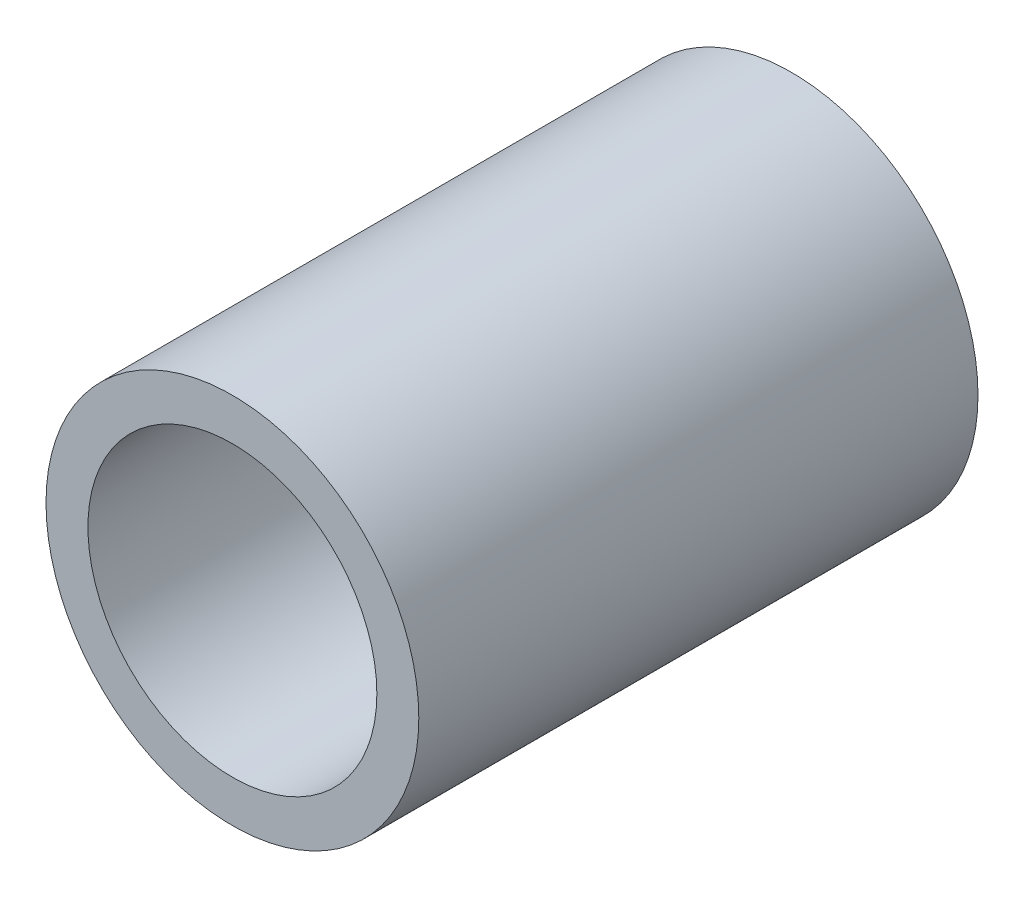
ISO-10303-21;
HEADER;
FILE_DESCRIPTION(('STEP AP214'),'2;1');
FILE_NAME('part.step','',(''),(''),'','','');
FILE_SCHEMA(('AUTOMOTIVE_DESIGN { 1 0 10303 214 1 1 1 1 }'));
ENDSEC;
DATA;
#1=APPLICATION_CONTEXT('core data for automotive mechanical design processes');
#2=APPLICATION_PROTOCOL_DEFINITION('international standard','automotive_design',2000,#1);
#3=PRODUCT_CONTEXT('',#1,'mechanical');
#4=PRODUCT('Part','Part','',(#3));
#5=PRODUCT_RELATED_PRODUCT_CATEGORY('part','',(#4));
#6=PRODUCT_DEFINITION_FORMATION('','',#4);
#7=PRODUCT_DEFINITION_CONTEXT('part definition',#1,'design');
#8=PRODUCT_DEFINITION('design','',#6,#7);
#9=PRODUCT_DEFINITION_SHAPE('','',#8);
#10=(LENGTH_UNIT() NAMED_UNIT(*) SI_UNIT(.MILLI.,.METRE.));
#11=(NAMED_UNIT(*) PLANE_ANGLE_UNIT() SI_UNIT($,.RADIAN.));
#12=(NAMED_UNIT(*) SI_UNIT($,.STERADIAN.) SOLID_ANGLE_UNIT());
#13=UNCERTAINTY_MEASURE_WITH_UNIT(LENGTH_MEASURE(1.E-05),#10,'distance_accuracy_value','');
#14=(GEOMETRIC_REPRESENTATION_CONTEXT(3) GLOBAL_UNCERTAINTY_ASSIGNED_CONTEXT((#13)) GLOBAL_UNIT_ASSIGNED_CONTEXT((#10,
#11,#12)) REPRESENTATION_CONTEXT('',''));
#15=CARTESIAN_POINT('',(0.,0.,0.));
#16=DIRECTION('',(0.,0.,1.));
#17=DIRECTION('',(1.,0.,0.));
#18=AXIS2_PLACEMENT_3D('',#15,#16,#17);
#19=CARTESIAN_POINT('',(0.,0.,3.));
#20=DIRECTION('',(0.,0.,1.));
#21=DIRECTION('',(1.,0.,0.));
#22=AXIS2_PLACEMENT_3D('',#19,#20,#21);
#23=PLANE('',#22);
#24=CARTESIAN_POINT('',(0.,0.,3.));
#25=DIRECTION('',(0.,0.,1.));
#26=DIRECTION('',(1.,0.,0.));
#27=AXIS2_PLACEMENT_3D('',#24,#25,#26);
#28=CIRCLE('',#27,1.);
#29=CARTESIAN_POINT('',(1.,0.,3.));
#30=VERTEX_POINT('',#29);
#31=EDGE_CURVE('E10',#30,#30,#28,.T.);
#32=ORIENTED_EDGE('',*,*,#31,.T.);
#33=EDGE_LOOP('',(#32));
#34=FACE_BOUND('',#33,.T.);
#35=CARTESIAN_POINT('',(0.,0.,3.));
#36=DIRECTION('',(0.,0.,1.));
#37=DIRECTION('',(1.,0.,0.));
#38=AXIS2_PLACEMENT_3D('',#35,#36,#37);
#39=CIRCLE('',#38,0.775);
#40=CARTESIAN_POINT('',(0.775,0.,3.));
#41=VERTEX_POINT('',#40);
#42=EDGE_CURVE('E43',#41,#41,#39,.T.);
#43=ORIENTED_EDGE('',*,*,#42,.F.);
#44=EDGE_LOOP('',(#43));
#45=FACE_BOUND('',#44,.T.);
#46=ADVANCED_FACE('F32',(#34,#45),#23,.T.);
#47=CARTESIAN_POINT('',(0.,0.,0.));
#48=DIRECTION('',(0.,0.,1.));
#49=DIRECTION('',(1.,0.,0.));
#50=AXIS2_PLACEMENT_3D('',#47,#48,#49);
#51=PLANE('',#50);
#52=CARTESIAN_POINT('',(0.,0.,0.));
#53=DIRECTION('',(0.,0.,1.));
#54=DIRECTION('',(1.,0.,0.));
#55=AXIS2_PLACEMENT_3D('',#52,#53,#54);
#56=CIRCLE('',#55,1.);
#57=CARTESIAN_POINT('',(1.,0.,0.));
#58=VERTEX_POINT('',#57);
#59=EDGE_CURVE('E36',#58,#58,#56,.T.);
#60=ORIENTED_EDGE('',*,*,#59,.F.);
#61=EDGE_LOOP('',(#60));
#62=FACE_BOUND('',#61,.T.);
#63=CARTESIAN_POINT('',(0.,0.,0.));
#64=DIRECTION('',(0.,0.,1.));
#65=DIRECTION('',(1.,0.,0.));
#66=AXIS2_PLACEMENT_3D('',#63,#64,#65);
#67=CIRCLE('',#66,0.775);
#68=CARTESIAN_POINT('',(0.775,0.,0.));
#69=VERTEX_POINT('',#68);
#70=EDGE_CURVE('E45',#69,#69,#67,.T.);
#71=ORIENTED_EDGE('',*,*,#70,.T.);
#72=EDGE_LOOP('',(#71));
#73=FACE_BOUND('',#72,.T.);
#74=ADVANCED_FACE('F55',(#62,#73),#51,.F.);
#75=CARTESIAN_POINT('',(0.,0.,3.));
#76=DIRECTION('',(0.,0.,-1.));
#77=DIRECTION('',(-1.,0.,0.));
#78=AXIS2_PLACEMENT_3D('',#75,#76,#77);
#79=CYLINDRICAL_SURFACE('',#78,1.);
#80=ORIENTED_EDGE('',*,*,#31,.F.);
#81=EDGE_LOOP('',(#80));
#82=FACE_BOUND('',#81,.T.);
#83=ORIENTED_EDGE('',*,*,#59,.T.);
#84=EDGE_LOOP('',(#83));
#85=FACE_BOUND('',#84,.T.);
#86=ADVANCED_FACE('F34',(#82,#85),#79,.T.);
#87=CARTESIAN_POINT('',(0.,0.,3.));
#88=DIRECTION('',(0.,0.,-1.));
#89=DIRECTION('',(-1.,0.,0.));
#90=AXIS2_PLACEMENT_3D('',#87,#88,#89);
#91=CYLINDRICAL_SURFACE('',#90,0.775);
#92=ORIENTED_EDGE('',*,*,#42,.T.);
#93=EDGE_LOOP('',(#92));
#94=FACE_BOUND('',#93,.T.);
#95=ORIENTED_EDGE('',*,*,#70,.F.);
#96=EDGE_LOOP('',(#95));
#97=FACE_BOUND('',#96,.T.);
#98=ADVANCED_FACE('F51',(#94,#97),#91,.F.);
#99=CLOSED_SHELL('',(#46,#74,#86,#98));
#100=MANIFOLD_SOLID_BREP('B2',#99);
#101=ADVANCED_BREP_SHAPE_REPRESENTATION('',(#18,#100),#14);
#102=SHAPE_DEFINITION_REPRESENTATION(#9,#101);
ENDSEC;
END-ISO-10303-21;
